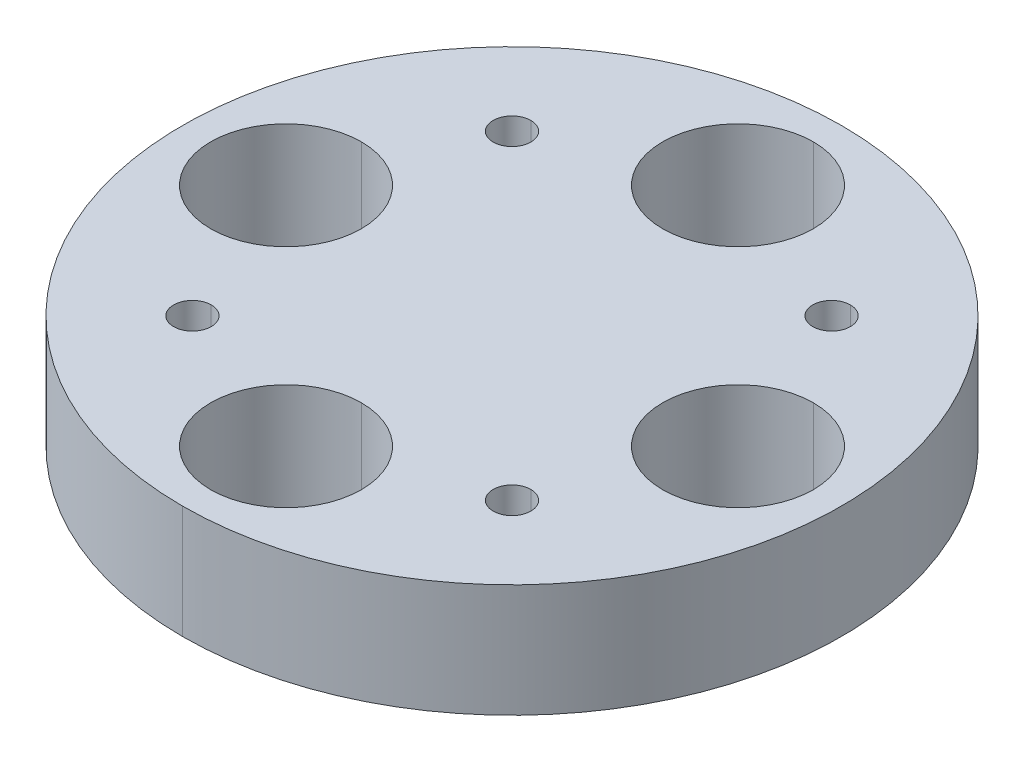
ISO-10303-21;
HEADER;
FILE_DESCRIPTION(('STEP AP214'),'2;1');
FILE_NAME('part.step','',(''),(''),'','','');
FILE_SCHEMA(('AUTOMOTIVE_DESIGN { 1 0 10303 214 1 1 1 1 }'));
ENDSEC;
DATA;
#1=APPLICATION_CONTEXT('core data for automotive mechanical design processes');
#2=APPLICATION_PROTOCOL_DEFINITION('international standard','automotive_design',2000,#1);
#3=PRODUCT_CONTEXT('',#1,'mechanical');
#4=PRODUCT('Part','Part','',(#3));
#5=PRODUCT_RELATED_PRODUCT_CATEGORY('part','',(#4));
#6=PRODUCT_DEFINITION_FORMATION('','',#4);
#7=PRODUCT_DEFINITION_CONTEXT('part definition',#1,'design');
#8=PRODUCT_DEFINITION('design','',#6,#7);
#9=PRODUCT_DEFINITION_SHAPE('','',#8);
#10=(LENGTH_UNIT() NAMED_UNIT(*) SI_UNIT(.MILLI.,.METRE.));
#11=(NAMED_UNIT(*) PLANE_ANGLE_UNIT() SI_UNIT($,.RADIAN.));
#12=(NAMED_UNIT(*) SI_UNIT($,.STERADIAN.) SOLID_ANGLE_UNIT());
#13=UNCERTAINTY_MEASURE_WITH_UNIT(LENGTH_MEASURE(1.E-05),#10,'distance_accuracy_value','');
#14=(GEOMETRIC_REPRESENTATION_CONTEXT(3) GLOBAL_UNCERTAINTY_ASSIGNED_CONTEXT((#13)) GLOBAL_UNIT_ASSIGNED_CONTEXT((#10,
#11,#12)) REPRESENTATION_CONTEXT('',''));
#15=CARTESIAN_POINT('',(0.,0.,0.));
#16=DIRECTION('',(0.,0.,1.));
#17=DIRECTION('',(1.,0.,0.));
#18=AXIS2_PLACEMENT_3D('',#15,#16,#17);
#19=CARTESIAN_POINT('',(4.24264068711926,-7.,-4.24264068711931));
#20=DIRECTION('',(0.,1.,0.));
#21=DIRECTION('',(0.,0.,1.));
#22=AXIS2_PLACEMENT_3D('',#19,#20,#21);
#23=CYLINDRICAL_SURFACE('',#22,0.5);
#24=DIRECTION('',(0.,1.,0.));
#25=VECTOR('',#24,1.);
#26=CARTESIAN_POINT('',(4.24264068711926,-7.,-4.74264068711931));
#27=LINE('',#26,#25);
#28=CARTESIAN_POINT('',(4.24264068711926,0.,-4.74264068711931));
#29=VERTEX_POINT('',#28);
#30=CARTESIAN_POINT('',(4.24264068711926,3.,-4.74264068711931));
#31=VERTEX_POINT('',#30);
#32=EDGE_CURVE('E347',#29,#31,#27,.T.);
#33=ORIENTED_EDGE('',*,*,#32,.F.);
#34=CARTESIAN_POINT('',(4.24264068711926,0.,-4.24264068711931));
#35=DIRECTION('',(0.,1.,0.));
#36=DIRECTION('',(0.,0.,1.));
#37=AXIS2_PLACEMENT_3D('',#34,#35,#36);
#38=CIRCLE('',#37,0.5);
#39=CARTESIAN_POINT('',(4.24264068711926,0.,-3.74264068711931));
#40=VERTEX_POINT('',#39);
#41=EDGE_CURVE('E209',#40,#29,#38,.T.);
#42=ORIENTED_EDGE('',*,*,#41,.F.);
#43=DIRECTION('',(0.,1.,0.));
#44=VECTOR('',#43,1.);
#45=CARTESIAN_POINT('',(4.24264068711926,-7.,-3.74264068711931));
#46=LINE('',#45,#44);
#47=CARTESIAN_POINT('',(4.24264068711926,3.,-3.74264068711931));
#48=VERTEX_POINT('',#47);
#49=EDGE_CURVE('E336',#40,#48,#46,.T.);
#50=ORIENTED_EDGE('',*,*,#49,.T.);
#51=CARTESIAN_POINT('',(4.24264068711926,3.,-4.24264068711931));
#52=DIRECTION('',(0.,1.,0.));
#53=DIRECTION('',(0.,0.,1.));
#54=AXIS2_PLACEMENT_3D('',#51,#52,#53);
#55=CIRCLE('',#54,0.5);
#56=EDGE_CURVE('E189',#48,#31,#55,.T.);
#57=ORIENTED_EDGE('',*,*,#56,.T.);
#58=EDGE_LOOP('',(#33,#42,#50,#57));
#59=FACE_BOUND('',#58,.T.);
#60=ADVANCED_FACE('F17',(#59),#23,.F.);
#61=CARTESIAN_POINT('',(4.24264068711929,-7.,4.24264068711927));
#62=DIRECTION('',(0.,1.,0.));
#63=DIRECTION('',(0.,0.,1.));
#64=AXIS2_PLACEMENT_3D('',#61,#62,#63);
#65=CYLINDRICAL_SURFACE('',#64,0.5);
#66=DIRECTION('',(0.,1.,0.));
#67=VECTOR('',#66,1.);
#68=CARTESIAN_POINT('',(4.24264068711929,-7.,3.74264068711928));
#69=LINE('',#68,#67);
#70=CARTESIAN_POINT('',(4.24264068711929,0.,3.74264068711928));
#71=VERTEX_POINT('',#70);
#72=CARTESIAN_POINT('',(4.24264068711929,3.,3.74264068711928));
#73=VERTEX_POINT('',#72);
#74=EDGE_CURVE('E319',#71,#73,#69,.T.);
#75=ORIENTED_EDGE('',*,*,#74,.F.);
#76=CARTESIAN_POINT('',(4.24264068711929,0.,4.24264068711927));
#77=DIRECTION('',(0.,1.,0.));
#78=DIRECTION('',(0.,0.,1.));
#79=AXIS2_PLACEMENT_3D('',#76,#77,#78);
#80=CIRCLE('',#79,0.5);
#81=CARTESIAN_POINT('',(4.24264068711929,0.,4.74264068711928));
#82=VERTEX_POINT('',#81);
#83=EDGE_CURVE('E213',#82,#71,#80,.T.);
#84=ORIENTED_EDGE('',*,*,#83,.F.);
#85=DIRECTION('',(0.,1.,0.));
#86=VECTOR('',#85,1.);
#87=CARTESIAN_POINT('',(4.24264068711929,-7.,4.74264068711928));
#88=LINE('',#87,#86);
#89=CARTESIAN_POINT('',(4.24264068711929,3.,4.74264068711928));
#90=VERTEX_POINT('',#89);
#91=EDGE_CURVE('E310',#82,#90,#88,.T.);
#92=ORIENTED_EDGE('',*,*,#91,.T.);
#93=CARTESIAN_POINT('',(4.24264068711929,3.,4.24264068711927));
#94=DIRECTION('',(0.,1.,0.));
#95=DIRECTION('',(0.,0.,1.));
#96=AXIS2_PLACEMENT_3D('',#93,#94,#95);
#97=CIRCLE('',#96,0.5);
#98=EDGE_CURVE('E193',#90,#73,#97,.T.);
#99=ORIENTED_EDGE('',*,*,#98,.T.);
#100=EDGE_LOOP('',(#75,#84,#92,#99));
#101=FACE_BOUND('',#100,.T.);
#102=ADVANCED_FACE('F434',(#101),#65,.F.);
#103=CARTESIAN_POINT('',(-4.24264068711926,-7.,4.24264068711931));
#104=DIRECTION('',(0.,1.,0.));
#105=DIRECTION('',(0.,0.,1.));
#106=AXIS2_PLACEMENT_3D('',#103,#104,#105);
#107=CYLINDRICAL_SURFACE('',#106,0.5);
#108=DIRECTION('',(0.,1.,0.));
#109=VECTOR('',#108,1.);
#110=CARTESIAN_POINT('',(-4.24264068711926,-7.,3.74264068711931));
#111=LINE('',#110,#109);
#112=CARTESIAN_POINT('',(-4.24264068711926,0.,3.74264068711931));
#113=VERTEX_POINT('',#112);
#114=CARTESIAN_POINT('',(-4.24264068711926,3.,3.74264068711931));
#115=VERTEX_POINT('',#114);
#116=EDGE_CURVE('E309',#113,#115,#111,.T.);
#117=ORIENTED_EDGE('',*,*,#116,.F.);
#118=CARTESIAN_POINT('',(-4.24264068711926,0.,4.24264068711931));
#119=DIRECTION('',(0.,1.,0.));
#120=DIRECTION('',(0.,0.,1.));
#121=AXIS2_PLACEMENT_3D('',#118,#119,#120);
#122=CIRCLE('',#121,0.5);
#123=CARTESIAN_POINT('',(-4.24264068711926,0.,4.74264068711931));
#124=VERTEX_POINT('',#123);
#125=EDGE_CURVE('E217',#124,#113,#122,.T.);
#126=ORIENTED_EDGE('',*,*,#125,.F.);
#127=DIRECTION('',(0.,1.,0.));
#128=VECTOR('',#127,1.);
#129=CARTESIAN_POINT('',(-4.24264068711926,-7.,4.74264068711931));
#130=LINE('',#129,#128);
#131=CARTESIAN_POINT('',(-4.24264068711926,3.,4.74264068711931));
#132=VERTEX_POINT('',#131);
#133=EDGE_CURVE('E300',#124,#132,#130,.T.);
#134=ORIENTED_EDGE('',*,*,#133,.T.);
#135=CARTESIAN_POINT('',(-4.24264068711926,3.,4.24264068711931));
#136=DIRECTION('',(0.,1.,0.));
#137=DIRECTION('',(0.,0.,1.));
#138=AXIS2_PLACEMENT_3D('',#135,#136,#137);
#139=CIRCLE('',#138,0.5);
#140=EDGE_CURVE('E197',#132,#115,#139,.T.);
#141=ORIENTED_EDGE('',*,*,#140,.T.);
#142=EDGE_LOOP('',(#117,#126,#134,#141));
#143=FACE_BOUND('',#142,.T.);
#144=ADVANCED_FACE('F420',(#143),#107,.F.);
#145=CARTESIAN_POINT('',(-4.24264068711929,-7.,-4.24264068711928));
#146=DIRECTION('',(0.,1.,0.));
#147=DIRECTION('',(0.,0.,1.));
#148=AXIS2_PLACEMENT_3D('',#145,#146,#147);
#149=CYLINDRICAL_SURFACE('',#148,0.5);
#150=DIRECTION('',(0.,1.,0.));
#151=VECTOR('',#150,1.);
#152=CARTESIAN_POINT('',(-4.24264068711929,-7.,-4.74264068711928));
#153=LINE('',#152,#151);
#154=CARTESIAN_POINT('',(-4.24264068711929,0.,-4.74264068711928));
#155=VERTEX_POINT('',#154);
#156=CARTESIAN_POINT('',(-4.24264068711929,3.,-4.74264068711928));
#157=VERTEX_POINT('',#156);
#158=EDGE_CURVE('E299',#155,#157,#153,.T.);
#159=ORIENTED_EDGE('',*,*,#158,.F.);
#160=CARTESIAN_POINT('',(-4.24264068711929,0.,-4.24264068711928));
#161=DIRECTION('',(0.,1.,0.));
#162=DIRECTION('',(0.,0.,1.));
#163=AXIS2_PLACEMENT_3D('',#160,#161,#162);
#164=CIRCLE('',#163,0.5);
#165=CARTESIAN_POINT('',(-4.24264068711929,0.,-3.74264068711928));
#166=VERTEX_POINT('',#165);
#167=EDGE_CURVE('E220',#166,#155,#164,.T.);
#168=ORIENTED_EDGE('',*,*,#167,.F.);
#169=DIRECTION('',(0.,1.,0.));
#170=VECTOR('',#169,1.);
#171=CARTESIAN_POINT('',(-4.24264068711929,-7.,-3.74264068711928));
#172=LINE('',#171,#170);
#173=CARTESIAN_POINT('',(-4.24264068711929,3.,-3.74264068711928));
#174=VERTEX_POINT('',#173);
#175=EDGE_CURVE('E295',#166,#174,#172,.T.);
#176=ORIENTED_EDGE('',*,*,#175,.T.);
#177=CARTESIAN_POINT('',(-4.24264068711929,3.,-4.24264068711928));
#178=DIRECTION('',(0.,1.,0.));
#179=DIRECTION('',(0.,0.,1.));
#180=AXIS2_PLACEMENT_3D('',#177,#178,#179);
#181=CIRCLE('',#180,0.5);
#182=EDGE_CURVE('E176',#174,#157,#181,.T.);
#183=ORIENTED_EDGE('',*,*,#182,.T.);
#184=EDGE_LOOP('',(#159,#168,#176,#183));
#185=FACE_BOUND('',#184,.T.);
#186=ADVANCED_FACE('F454',(#185),#149,.F.);
#187=CARTESIAN_POINT('',(6.,-7.,0.));
#188=DIRECTION('',(0.,1.,0.));
#189=DIRECTION('',(0.,0.,1.));
#190=AXIS2_PLACEMENT_3D('',#187,#188,#189);
#191=CYLINDRICAL_SURFACE('',#190,2.);
#192=DIRECTION('',(0.,1.,0.));
#193=VECTOR('',#192,1.);
#194=CARTESIAN_POINT('',(6.,-7.,-2.));
#195=LINE('',#194,#193);
#196=CARTESIAN_POINT('',(6.,0.,-2.));
#197=VERTEX_POINT('',#196);
#198=CARTESIAN_POINT('',(6.,3.,-2.));
#199=VERTEX_POINT('',#198);
#200=EDGE_CURVE('E287',#197,#199,#195,.T.);
#201=ORIENTED_EDGE('',*,*,#200,.F.);
#202=CARTESIAN_POINT('',(6.,0.,0.));
#203=DIRECTION('',(0.,1.,0.));
#204=DIRECTION('',(0.,0.,1.));
#205=AXIS2_PLACEMENT_3D('',#202,#203,#204);
#206=CIRCLE('',#205,2.);
#207=CARTESIAN_POINT('',(6.,0.,2.));
#208=VERTEX_POINT('',#207);
#209=EDGE_CURVE('E222',#208,#197,#206,.T.);
#210=ORIENTED_EDGE('',*,*,#209,.F.);
#211=DIRECTION('',(0.,1.,0.));
#212=VECTOR('',#211,1.);
#213=CARTESIAN_POINT('',(6.,-7.,2.));
#214=LINE('',#213,#212);
#215=CARTESIAN_POINT('',(6.,3.,2.));
#216=VERTEX_POINT('',#215);
#217=EDGE_CURVE('E278',#208,#216,#214,.T.);
#218=ORIENTED_EDGE('',*,*,#217,.T.);
#219=CARTESIAN_POINT('',(6.,3.,0.));
#220=DIRECTION('',(0.,1.,0.));
#221=DIRECTION('',(0.,0.,1.));
#222=AXIS2_PLACEMENT_3D('',#219,#220,#221);
#223=CIRCLE('',#222,2.);
#224=EDGE_CURVE('E172',#216,#199,#223,.T.);
#225=ORIENTED_EDGE('',*,*,#224,.T.);
#226=EDGE_LOOP('',(#201,#210,#218,#225));
#227=FACE_BOUND('',#226,.T.);
#228=ADVANCED_FACE('F459',(#227),#191,.F.);
#229=CARTESIAN_POINT('',(0.,-7.,6.));
#230=DIRECTION('',(0.,1.,0.));
#231=DIRECTION('',(0.,0.,1.));
#232=AXIS2_PLACEMENT_3D('',#229,#230,#231);
#233=CYLINDRICAL_SURFACE('',#232,2.);
#234=DIRECTION('',(0.,1.,0.));
#235=VECTOR('',#234,1.);
#236=CARTESIAN_POINT('',(0.,-7.,4.));
#237=LINE('',#236,#235);
#238=CARTESIAN_POINT('',(0.,0.,4.));
#239=VERTEX_POINT('',#238);
#240=CARTESIAN_POINT('',(0.,3.,4.));
#241=VERTEX_POINT('',#240);
#242=EDGE_CURVE('E262',#239,#241,#237,.T.);
#243=ORIENTED_EDGE('',*,*,#242,.F.);
#244=CARTESIAN_POINT('',(0.,0.,6.));
#245=DIRECTION('',(0.,1.,0.));
#246=DIRECTION('',(0.,0.,1.));
#247=AXIS2_PLACEMENT_3D('',#244,#245,#246);
#248=CIRCLE('',#247,2.);
#249=CARTESIAN_POINT('',(0.,0.,8.));
#250=VERTEX_POINT('',#249);
#251=EDGE_CURVE('E230',#250,#239,#248,.T.);
#252=ORIENTED_EDGE('',*,*,#251,.F.);
#253=DIRECTION('',(0.,1.,0.));
#254=VECTOR('',#253,1.);
#255=CARTESIAN_POINT('',(0.,-7.,8.));
#256=LINE('',#255,#254);
#257=CARTESIAN_POINT('',(0.,3.,8.));
#258=VERTEX_POINT('',#257);
#259=EDGE_CURVE('E242',#250,#258,#256,.T.);
#260=ORIENTED_EDGE('',*,*,#259,.T.);
#261=CARTESIAN_POINT('',(0.,3.,6.));
#262=DIRECTION('',(0.,1.,0.));
#263=DIRECTION('',(0.,0.,1.));
#264=AXIS2_PLACEMENT_3D('',#261,#262,#263);
#265=CIRCLE('',#264,2.);
#266=EDGE_CURVE('E175',#258,#241,#265,.T.);
#267=ORIENTED_EDGE('',*,*,#266,.T.);
#268=EDGE_LOOP('',(#243,#252,#260,#267));
#269=FACE_BOUND('',#268,.T.);
#270=ADVANCED_FACE('F260',(#269),#233,.F.);
#271=CARTESIAN_POINT('',(-6.,-7.,0.));
#272=DIRECTION('',(0.,1.,0.));
#273=DIRECTION('',(0.,0.,1.));
#274=AXIS2_PLACEMENT_3D('',#271,#272,#273);
#275=CYLINDRICAL_SURFACE('',#274,2.);
#276=DIRECTION('',(0.,1.,0.));
#277=VECTOR('',#276,1.);
#278=CARTESIAN_POINT('',(-6.,-7.,-2.));
#279=LINE('',#278,#277);
#280=CARTESIAN_POINT('',(-6.,0.,-2.));
#281=VERTEX_POINT('',#280);
#282=CARTESIAN_POINT('',(-6.,3.,-2.));
#283=VERTEX_POINT('',#282);
#284=EDGE_CURVE('E250',#281,#283,#279,.T.);
#285=ORIENTED_EDGE('',*,*,#284,.F.);
#286=CARTESIAN_POINT('',(-6.,0.,0.));
#287=DIRECTION('',(0.,1.,0.));
#288=DIRECTION('',(0.,0.,1.));
#289=AXIS2_PLACEMENT_3D('',#286,#287,#288);
#290=CIRCLE('',#289,2.);
#291=CARTESIAN_POINT('',(-6.,0.,2.));
#292=VERTEX_POINT('',#291);
#293=EDGE_CURVE('E20',#292,#281,#290,.T.);
#294=ORIENTED_EDGE('',*,*,#293,.F.);
#295=DIRECTION('',(0.,1.,0.));
#296=VECTOR('',#295,1.);
#297=CARTESIAN_POINT('',(-6.,-7.,2.));
#298=LINE('',#297,#296);
#299=CARTESIAN_POINT('',(-6.,3.,2.));
#300=VERTEX_POINT('',#299);
#301=EDGE_CURVE('E166',#292,#300,#298,.T.);
#302=ORIENTED_EDGE('',*,*,#301,.T.);
#303=CARTESIAN_POINT('',(-6.,3.,0.));
#304=DIRECTION('',(0.,1.,0.));
#305=DIRECTION('',(0.,0.,1.));
#306=AXIS2_PLACEMENT_3D('',#303,#304,#305);
#307=CIRCLE('',#306,2.);
#308=EDGE_CURVE('E203',#300,#283,#307,.T.);
#309=ORIENTED_EDGE('',*,*,#308,.T.);
#310=EDGE_LOOP('',(#285,#294,#302,#309));
#311=FACE_BOUND('',#310,.T.);
#312=ADVANCED_FACE('F457',(#311),#275,.F.);
#313=CARTESIAN_POINT('',(0.,-7.,-6.));
#314=DIRECTION('',(0.,1.,0.));
#315=DIRECTION('',(0.,0.,1.));
#316=AXIS2_PLACEMENT_3D('',#313,#314,#315);
#317=CYLINDRICAL_SURFACE('',#316,2.);
#318=DIRECTION('',(0.,1.,0.));
#319=VECTOR('',#318,1.);
#320=CARTESIAN_POINT('',(0.,-7.,-8.));
#321=LINE('',#320,#319);
#322=CARTESIAN_POINT('',(0.,0.,-8.));
#323=VERTEX_POINT('',#322);
#324=CARTESIAN_POINT('',(0.,3.,-8.));
#325=VERTEX_POINT('',#324);
#326=EDGE_CURVE('E171',#323,#325,#321,.T.);
#327=ORIENTED_EDGE('',*,*,#326,.F.);
#328=CARTESIAN_POINT('',(0.,0.,-6.));
#329=DIRECTION('',(0.,1.,0.));
#330=DIRECTION('',(0.,0.,1.));
#331=AXIS2_PLACEMENT_3D('',#328,#329,#330);
#332=CIRCLE('',#331,2.);
#333=CARTESIAN_POINT('',(0.,0.,-4.));
#334=VERTEX_POINT('',#333);
#335=EDGE_CURVE('E11',#334,#323,#332,.T.);
#336=ORIENTED_EDGE('',*,*,#335,.F.);
#337=DIRECTION('',(0.,1.,0.));
#338=VECTOR('',#337,1.);
#339=CARTESIAN_POINT('',(0.,-7.,-4.));
#340=LINE('',#339,#338);
#341=CARTESIAN_POINT('',(0.,3.,-4.));
#342=VERTEX_POINT('',#341);
#343=EDGE_CURVE('E154',#334,#342,#340,.T.);
#344=ORIENTED_EDGE('',*,*,#343,.T.);
#345=CARTESIAN_POINT('',(0.,3.,-6.));
#346=DIRECTION('',(0.,1.,0.));
#347=DIRECTION('',(0.,0.,1.));
#348=AXIS2_PLACEMENT_3D('',#345,#346,#347);
#349=CIRCLE('',#348,2.);
#350=EDGE_CURVE('E206',#342,#325,#349,.T.);
#351=ORIENTED_EDGE('',*,*,#350,.T.);
#352=EDGE_LOOP('',(#327,#336,#344,#351));
#353=FACE_BOUND('',#352,.T.);
#354=ADVANCED_FACE('F427',(#353),#317,.F.);
#355=CARTESIAN_POINT('',(0.,0.,0.));
#356=DIRECTION('',(0.,1.,0.));
#357=DIRECTION('',(1.,0.,0.));
#358=AXIS2_PLACEMENT_3D('',#355,#356,#357);
#359=PLANE('',#358);
#360=ORIENTED_EDGE('',*,*,#335,.T.);
#361=CARTESIAN_POINT('',(0.,0.,-6.));
#362=DIRECTION('',(0.,1.,0.));
#363=DIRECTION('',(0.,0.,1.));
#364=AXIS2_PLACEMENT_3D('',#361,#362,#363);
#365=CIRCLE('',#364,2.);
#366=EDGE_CURVE('E168',#323,#334,#365,.T.);
#367=ORIENTED_EDGE('',*,*,#366,.T.);
#368=EDGE_LOOP('',(#360,#367));
#369=FACE_BOUND('',#368,.T.);
#370=ORIENTED_EDGE('',*,*,#293,.T.);
#371=CARTESIAN_POINT('',(-6.,0.,0.));
#372=DIRECTION('',(0.,1.,0.));
#373=DIRECTION('',(0.,0.,1.));
#374=AXIS2_PLACEMENT_3D('',#371,#372,#373);
#375=CIRCLE('',#374,2.);
#376=EDGE_CURVE('E245',#281,#292,#375,.T.);
#377=ORIENTED_EDGE('',*,*,#376,.T.);
#378=EDGE_LOOP('',(#370,#377));
#379=FACE_BOUND('',#378,.T.);
#380=ORIENTED_EDGE('',*,*,#251,.T.);
#381=CARTESIAN_POINT('',(0.,0.,6.));
#382=DIRECTION('',(0.,1.,0.));
#383=DIRECTION('',(0.,0.,1.));
#384=AXIS2_PLACEMENT_3D('',#381,#382,#383);
#385=CIRCLE('',#384,2.);
#386=EDGE_CURVE('E272',#239,#250,#385,.T.);
#387=ORIENTED_EDGE('',*,*,#386,.T.);
#388=EDGE_LOOP('',(#380,#387));
#389=FACE_BOUND('',#388,.T.);
#390=ORIENTED_EDGE('',*,*,#209,.T.);
#391=CARTESIAN_POINT('',(6.,0.,0.));
#392=DIRECTION('',(0.,1.,0.));
#393=DIRECTION('',(0.,0.,1.));
#394=AXIS2_PLACEMENT_3D('',#391,#392,#393);
#395=CIRCLE('',#394,2.);
#396=EDGE_CURVE('E292',#197,#208,#395,.T.);
#397=ORIENTED_EDGE('',*,*,#396,.T.);
#398=EDGE_LOOP('',(#390,#397));
#399=FACE_BOUND('',#398,.T.);
#400=ORIENTED_EDGE('',*,*,#167,.T.);
#401=CARTESIAN_POINT('',(-4.24264068711929,0.,-4.24264068711928));
#402=DIRECTION('',(0.,1.,0.));
#403=DIRECTION('',(0.,0.,1.));
#404=AXIS2_PLACEMENT_3D('',#401,#402,#403);
#405=CIRCLE('',#404,0.5);
#406=EDGE_CURVE('E296',#155,#166,#405,.T.);
#407=ORIENTED_EDGE('',*,*,#406,.T.);
#408=EDGE_LOOP('',(#400,#407));
#409=FACE_BOUND('',#408,.T.);
#410=ORIENTED_EDGE('',*,*,#125,.T.);
#411=CARTESIAN_POINT('',(-4.24264068711926,0.,4.24264068711931));
#412=DIRECTION('',(0.,1.,0.));
#413=DIRECTION('',(0.,0.,1.));
#414=AXIS2_PLACEMENT_3D('',#411,#412,#413);
#415=CIRCLE('',#414,0.5);
#416=EDGE_CURVE('E305',#113,#124,#415,.T.);
#417=ORIENTED_EDGE('',*,*,#416,.T.);
#418=EDGE_LOOP('',(#410,#417));
#419=FACE_BOUND('',#418,.T.);
#420=ORIENTED_EDGE('',*,*,#83,.T.);
#421=CARTESIAN_POINT('',(4.24264068711929,0.,4.24264068711927));
#422=DIRECTION('',(0.,1.,0.));
#423=DIRECTION('',(0.,0.,1.));
#424=AXIS2_PLACEMENT_3D('',#421,#422,#423);
#425=CIRCLE('',#424,0.5);
#426=EDGE_CURVE('E326',#71,#82,#425,.T.);
#427=ORIENTED_EDGE('',*,*,#426,.T.);
#428=EDGE_LOOP('',(#420,#427));
#429=FACE_BOUND('',#428,.T.);
#430=ORIENTED_EDGE('',*,*,#41,.T.);
#431=CARTESIAN_POINT('',(4.24264068711926,0.,-4.24264068711931));
#432=DIRECTION('',(0.,1.,0.));
#433=DIRECTION('',(0.,0.,1.));
#434=AXIS2_PLACEMENT_3D('',#431,#432,#433);
#435=CIRCLE('',#434,0.5);
#436=EDGE_CURVE('E357',#29,#40,#435,.T.);
#437=ORIENTED_EDGE('',*,*,#436,.T.);
#438=EDGE_LOOP('',(#430,#437));
#439=FACE_BOUND('',#438,.T.);
#440=CARTESIAN_POINT('',(0.,0.,0.));
#441=DIRECTION('',(0.,1.,0.));
#442=DIRECTION('',(0.,0.,1.));
#443=AXIS2_PLACEMENT_3D('',#440,#441,#442);
#444=CIRCLE('',#443,8.75);
#445=CARTESIAN_POINT('',(0.,0.,-8.75));
#446=VERTEX_POINT('',#445);
#447=CARTESIAN_POINT('',(0.,0.,8.75));
#448=VERTEX_POINT('',#447);
#449=EDGE_CURVE('E38',#446,#448,#444,.T.);
#450=ORIENTED_EDGE('',*,*,#449,.F.);
#451=CARTESIAN_POINT('',(0.,0.,0.));
#452=DIRECTION('',(0.,1.,0.));
#453=DIRECTION('',(0.,0.,1.));
#454=AXIS2_PLACEMENT_3D('',#451,#452,#453);
#455=CIRCLE('',#454,8.75);
#456=EDGE_CURVE('E150',#448,#446,#455,.T.);
#457=ORIENTED_EDGE('',*,*,#456,.F.);
#458=EDGE_LOOP('',(#450,#457));
#459=FACE_BOUND('',#458,.T.);
#460=ADVANCED_FACE('F365',(#369,#379,#389,#399,#409,#419,#429,#439,#459),#359,.F.);
#461=CARTESIAN_POINT('',(0.,3.,0.));
#462=DIRECTION('',(0.,1.,0.));
#463=DIRECTION('',(1.,0.,0.));
#464=AXIS2_PLACEMENT_3D('',#461,#462,#463);
#465=PLANE('',#464);
#466=ORIENTED_EDGE('',*,*,#350,.F.);
#467=CARTESIAN_POINT('',(0.,3.,-6.));
#468=DIRECTION('',(0.,1.,0.));
#469=DIRECTION('',(0.,0.,1.));
#470=AXIS2_PLACEMENT_3D('',#467,#468,#469);
#471=CIRCLE('',#470,2.);
#472=EDGE_CURVE('E162',#325,#342,#471,.T.);
#473=ORIENTED_EDGE('',*,*,#472,.F.);
#474=EDGE_LOOP('',(#466,#473));
#475=FACE_BOUND('',#474,.T.);
#476=ORIENTED_EDGE('',*,*,#308,.F.);
#477=CARTESIAN_POINT('',(-6.,3.,0.));
#478=DIRECTION('',(0.,1.,0.));
#479=DIRECTION('',(0.,0.,1.));
#480=AXIS2_PLACEMENT_3D('',#477,#478,#479);
#481=CIRCLE('',#480,2.);
#482=EDGE_CURVE('E251',#283,#300,#481,.T.);
#483=ORIENTED_EDGE('',*,*,#482,.F.);
#484=EDGE_LOOP('',(#476,#483));
#485=FACE_BOUND('',#484,.T.);
#486=ORIENTED_EDGE('',*,*,#266,.F.);
#487=CARTESIAN_POINT('',(0.,3.,6.));
#488=DIRECTION('',(0.,1.,0.));
#489=DIRECTION('',(0.,0.,1.));
#490=AXIS2_PLACEMENT_3D('',#487,#488,#489);
#491=CIRCLE('',#490,2.);
#492=EDGE_CURVE('E246',#241,#258,#491,.T.);
#493=ORIENTED_EDGE('',*,*,#492,.F.);
#494=EDGE_LOOP('',(#486,#493));
#495=FACE_BOUND('',#494,.T.);
#496=ORIENTED_EDGE('',*,*,#224,.F.);
#497=CARTESIAN_POINT('',(6.,3.,0.));
#498=DIRECTION('',(0.,1.,0.));
#499=DIRECTION('',(0.,0.,1.));
#500=AXIS2_PLACEMENT_3D('',#497,#498,#499);
#501=CIRCLE('',#500,2.);
#502=EDGE_CURVE('E284',#199,#216,#501,.T.);
#503=ORIENTED_EDGE('',*,*,#502,.F.);
#504=EDGE_LOOP('',(#496,#503));
#505=FACE_BOUND('',#504,.T.);
#506=ORIENTED_EDGE('',*,*,#182,.F.);
#507=CARTESIAN_POINT('',(-4.24264068711929,3.,-4.24264068711928));
#508=DIRECTION('',(0.,1.,0.));
#509=DIRECTION('',(0.,0.,1.));
#510=AXIS2_PLACEMENT_3D('',#507,#508,#509);
#511=CIRCLE('',#510,0.5);
#512=EDGE_CURVE('E304',#157,#174,#511,.T.);
#513=ORIENTED_EDGE('',*,*,#512,.F.);
#514=EDGE_LOOP('',(#506,#513));
#515=FACE_BOUND('',#514,.T.);
#516=ORIENTED_EDGE('',*,*,#140,.F.);
#517=CARTESIAN_POINT('',(-4.24264068711926,3.,4.24264068711931));
#518=DIRECTION('',(0.,1.,0.));
#519=DIRECTION('',(0.,0.,1.));
#520=AXIS2_PLACEMENT_3D('',#517,#518,#519);
#521=CIRCLE('',#520,0.5);
#522=EDGE_CURVE('E314',#115,#132,#521,.T.);
#523=ORIENTED_EDGE('',*,*,#522,.F.);
#524=EDGE_LOOP('',(#516,#523));
#525=FACE_BOUND('',#524,.T.);
#526=ORIENTED_EDGE('',*,*,#98,.F.);
#527=CARTESIAN_POINT('',(4.24264068711929,3.,4.24264068711927));
#528=DIRECTION('',(0.,1.,0.));
#529=DIRECTION('',(0.,0.,1.));
#530=AXIS2_PLACEMENT_3D('',#527,#528,#529);
#531=CIRCLE('',#530,0.5);
#532=EDGE_CURVE('E315',#73,#90,#531,.T.);
#533=ORIENTED_EDGE('',*,*,#532,.F.);
#534=EDGE_LOOP('',(#526,#533));
#535=FACE_BOUND('',#534,.T.);
#536=ORIENTED_EDGE('',*,*,#56,.F.);
#537=CARTESIAN_POINT('',(4.24264068711926,3.,-4.24264068711931));
#538=DIRECTION('',(0.,1.,0.));
#539=DIRECTION('',(0.,0.,1.));
#540=AXIS2_PLACEMENT_3D('',#537,#538,#539);
#541=CIRCLE('',#540,0.5);
#542=EDGE_CURVE('E343',#31,#48,#541,.T.);
#543=ORIENTED_EDGE('',*,*,#542,.F.);
#544=EDGE_LOOP('',(#536,#543));
#545=FACE_BOUND('',#544,.T.);
#546=CARTESIAN_POINT('',(0.,3.,0.));
#547=DIRECTION('',(0.,1.,0.));
#548=DIRECTION('',(0.,0.,1.));
#549=AXIS2_PLACEMENT_3D('',#546,#547,#548);
#550=CIRCLE('',#549,8.75);
#551=CARTESIAN_POINT('',(0.,3.,-8.75));
#552=VERTEX_POINT('',#551);
#553=CARTESIAN_POINT('',(0.,3.,8.75));
#554=VERTEX_POINT('',#553);
#555=EDGE_CURVE('E136',#552,#554,#550,.T.);
#556=ORIENTED_EDGE('',*,*,#555,.T.);
#557=CARTESIAN_POINT('',(0.,3.,0.));
#558=DIRECTION('',(0.,1.,0.));
#559=DIRECTION('',(0.,0.,1.));
#560=AXIS2_PLACEMENT_3D('',#557,#558,#559);
#561=CIRCLE('',#560,8.75);
#562=EDGE_CURVE('E139',#554,#552,#561,.T.);
#563=ORIENTED_EDGE('',*,*,#562,.T.);
#564=EDGE_LOOP('',(#556,#563));
#565=FACE_BOUND('',#564,.T.);
#566=ADVANCED_FACE('F137',(#475,#485,#495,#505,#515,#525,#535,#545,#565),#465,.T.);
#567=CARTESIAN_POINT('',(0.,3.,0.));
#568=DIRECTION('',(0.,-1.,0.));
#569=DIRECTION('',(0.,0.,-1.));
#570=AXIS2_PLACEMENT_3D('',#567,#568,#569);
#571=CYLINDRICAL_SURFACE('',#570,8.75);
#572=DIRECTION('',(0.,-1.,0.));
#573=VECTOR('',#572,1.);
#574=CARTESIAN_POINT('',(0.,3.,8.75));
#575=LINE('',#574,#573);
#576=EDGE_CURVE('E145',#554,#448,#575,.T.);
#577=ORIENTED_EDGE('',*,*,#576,.F.);
#578=ORIENTED_EDGE('',*,*,#555,.F.);
#579=DIRECTION('',(0.,-1.,0.));
#580=VECTOR('',#579,1.);
#581=CARTESIAN_POINT('',(0.,3.,-8.75));
#582=LINE('',#581,#580);
#583=EDGE_CURVE('E142',#552,#446,#582,.T.);
#584=ORIENTED_EDGE('',*,*,#583,.T.);
#585=ORIENTED_EDGE('',*,*,#449,.T.);
#586=EDGE_LOOP('',(#577,#578,#584,#585));
#587=FACE_BOUND('',#586,.T.);
#588=ADVANCED_FACE('F146',(#587),#571,.T.);
#589=CARTESIAN_POINT('',(0.,3.,0.));
#590=DIRECTION('',(0.,-1.,0.));
#591=DIRECTION('',(0.,0.,-1.));
#592=AXIS2_PLACEMENT_3D('',#589,#590,#591);
#593=CYLINDRICAL_SURFACE('',#592,8.75);
#594=ORIENTED_EDGE('',*,*,#562,.F.);
#595=ORIENTED_EDGE('',*,*,#576,.T.);
#596=ORIENTED_EDGE('',*,*,#456,.T.);
#597=ORIENTED_EDGE('',*,*,#583,.F.);
#598=EDGE_LOOP('',(#594,#595,#596,#597));
#599=FACE_BOUND('',#598,.T.);
#600=ADVANCED_FACE('F152',(#599),#593,.T.);
#601=CARTESIAN_POINT('',(0.,-7.,-6.));
#602=DIRECTION('',(0.,1.,0.));
#603=DIRECTION('',(0.,0.,1.));
#604=AXIS2_PLACEMENT_3D('',#601,#602,#603);
#605=CYLINDRICAL_SURFACE('',#604,2.);
#606=ORIENTED_EDGE('',*,*,#366,.F.);
#607=ORIENTED_EDGE('',*,*,#326,.T.);
#608=ORIENTED_EDGE('',*,*,#472,.T.);
#609=ORIENTED_EDGE('',*,*,#343,.F.);
#610=EDGE_LOOP('',(#606,#607,#608,#609));
#611=FACE_BOUND('',#610,.T.);
#612=ADVANCED_FACE('F666',(#611),#605,.F.);
#613=CARTESIAN_POINT('',(-6.,-7.,0.));
#614=DIRECTION('',(0.,1.,0.));
#615=DIRECTION('',(0.,0.,1.));
#616=AXIS2_PLACEMENT_3D('',#613,#614,#615);
#617=CYLINDRICAL_SURFACE('',#616,2.);
#618=ORIENTED_EDGE('',*,*,#376,.F.);
#619=ORIENTED_EDGE('',*,*,#284,.T.);
#620=ORIENTED_EDGE('',*,*,#482,.T.);
#621=ORIENTED_EDGE('',*,*,#301,.F.);
#622=EDGE_LOOP('',(#618,#619,#620,#621));
#623=FACE_BOUND('',#622,.T.);
#624=ADVANCED_FACE('F674',(#623),#617,.F.);
#625=CARTESIAN_POINT('',(0.,-7.,6.));
#626=DIRECTION('',(0.,1.,0.));
#627=DIRECTION('',(0.,0.,1.));
#628=AXIS2_PLACEMENT_3D('',#625,#626,#627);
#629=CYLINDRICAL_SURFACE('',#628,2.);
#630=ORIENTED_EDGE('',*,*,#386,.F.);
#631=ORIENTED_EDGE('',*,*,#242,.T.);
#632=ORIENTED_EDGE('',*,*,#492,.T.);
#633=ORIENTED_EDGE('',*,*,#259,.F.);
#634=EDGE_LOOP('',(#630,#631,#632,#633));
#635=FACE_BOUND('',#634,.T.);
#636=ADVANCED_FACE('F270',(#635),#629,.F.);
#637=CARTESIAN_POINT('',(6.,-7.,0.));
#638=DIRECTION('',(0.,1.,0.));
#639=DIRECTION('',(0.,0.,1.));
#640=AXIS2_PLACEMENT_3D('',#637,#638,#639);
#641=CYLINDRICAL_SURFACE('',#640,2.);
#642=ORIENTED_EDGE('',*,*,#396,.F.);
#643=ORIENTED_EDGE('',*,*,#200,.T.);
#644=ORIENTED_EDGE('',*,*,#502,.T.);
#645=ORIENTED_EDGE('',*,*,#217,.F.);
#646=EDGE_LOOP('',(#642,#643,#644,#645));
#647=FACE_BOUND('',#646,.T.);
#648=ADVANCED_FACE('F683',(#647),#641,.F.);
#649=CARTESIAN_POINT('',(-4.24264068711929,-7.,-4.24264068711928));
#650=DIRECTION('',(0.,1.,0.));
#651=DIRECTION('',(0.,0.,1.));
#652=AXIS2_PLACEMENT_3D('',#649,#650,#651);
#653=CYLINDRICAL_SURFACE('',#652,0.5);
#654=ORIENTED_EDGE('',*,*,#406,.F.);
#655=ORIENTED_EDGE('',*,*,#158,.T.);
#656=ORIENTED_EDGE('',*,*,#512,.T.);
#657=ORIENTED_EDGE('',*,*,#175,.F.);
#658=EDGE_LOOP('',(#654,#655,#656,#657));
#659=FACE_BOUND('',#658,.T.);
#660=ADVANCED_FACE('F470',(#659),#653,.F.);
#661=CARTESIAN_POINT('',(-4.24264068711926,-7.,4.24264068711931));
#662=DIRECTION('',(0.,1.,0.));
#663=DIRECTION('',(0.,0.,1.));
#664=AXIS2_PLACEMENT_3D('',#661,#662,#663);
#665=CYLINDRICAL_SURFACE('',#664,0.5);
#666=ORIENTED_EDGE('',*,*,#416,.F.);
#667=ORIENTED_EDGE('',*,*,#116,.T.);
#668=ORIENTED_EDGE('',*,*,#522,.T.);
#669=ORIENTED_EDGE('',*,*,#133,.F.);
#670=EDGE_LOOP('',(#666,#667,#668,#669));
#671=FACE_BOUND('',#670,.T.);
#672=ADVANCED_FACE('F423',(#671),#665,.F.);
#673=CARTESIAN_POINT('',(4.24264068711929,-7.,4.24264068711927));
#674=DIRECTION('',(0.,1.,0.));
#675=DIRECTION('',(0.,0.,1.));
#676=AXIS2_PLACEMENT_3D('',#673,#674,#675);
#677=CYLINDRICAL_SURFACE('',#676,0.5);
#678=ORIENTED_EDGE('',*,*,#426,.F.);
#679=ORIENTED_EDGE('',*,*,#74,.T.);
#680=ORIENTED_EDGE('',*,*,#532,.T.);
#681=ORIENTED_EDGE('',*,*,#91,.F.);
#682=EDGE_LOOP('',(#678,#679,#680,#681));
#683=FACE_BOUND('',#682,.T.);
#684=ADVANCED_FACE('F437',(#683),#677,.F.);
#685=CARTESIAN_POINT('',(4.24264068711926,-7.,-4.24264068711931));
#686=DIRECTION('',(0.,1.,0.));
#687=DIRECTION('',(0.,0.,1.));
#688=AXIS2_PLACEMENT_3D('',#685,#686,#687);
#689=CYLINDRICAL_SURFACE('',#688,0.5);
#690=ORIENTED_EDGE('',*,*,#436,.F.);
#691=ORIENTED_EDGE('',*,*,#32,.T.);
#692=ORIENTED_EDGE('',*,*,#542,.T.);
#693=ORIENTED_EDGE('',*,*,#49,.F.);
#694=EDGE_LOOP('',(#690,#691,#692,#693));
#695=FACE_BOUND('',#694,.T.);
#696=ADVANCED_FACE('F374',(#695),#689,.F.);
#697=CLOSED_SHELL('',(#60,#102,#144,#186,#228,#270,#312,#354,#460,#566,#588,#600,#612,#624,#636,
#648,#660,#672,#684,#696));
#698=MANIFOLD_SOLID_BREP('B1',#697);
#699=ADVANCED_BREP_SHAPE_REPRESENTATION('',(#18,#698),#14);
#700=SHAPE_DEFINITION_REPRESENTATION(#9,#699);
ENDSEC;
END-ISO-10303-21;
